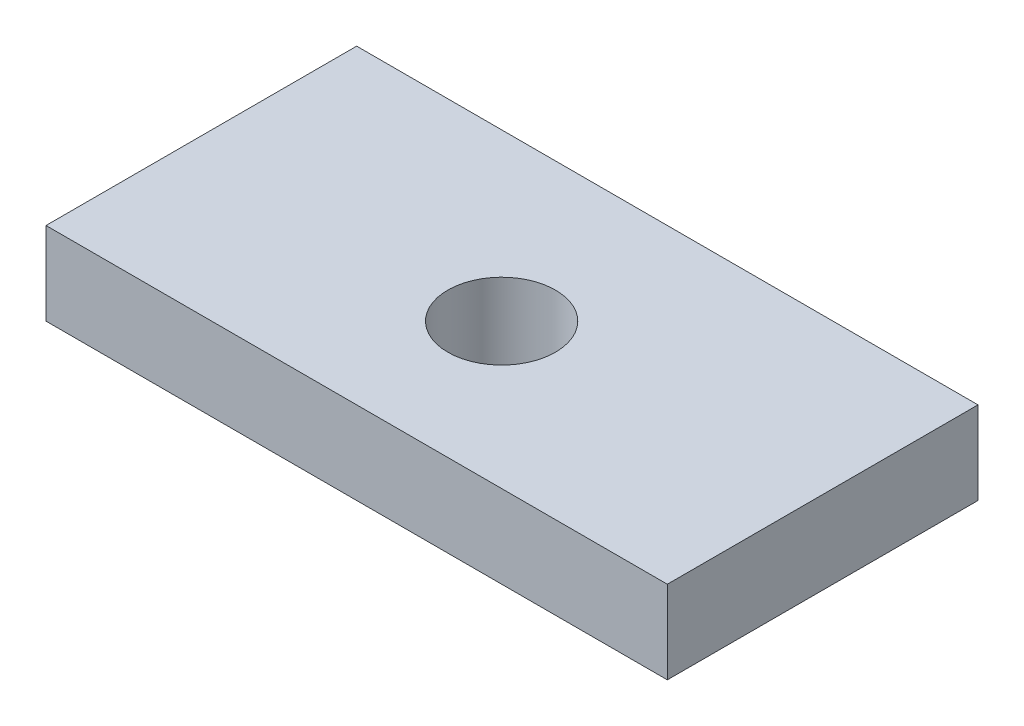
ISO-10303-21;
HEADER;
FILE_DESCRIPTION(('STEP AP214'),'2;1');
FILE_NAME('part.step','',(''),(''),'','','');
FILE_SCHEMA(('AUTOMOTIVE_DESIGN { 1 0 10303 214 1 1 1 1 }'));
ENDSEC;
DATA;
#1=APPLICATION_CONTEXT('core data for automotive mechanical design processes');
#2=APPLICATION_PROTOCOL_DEFINITION('international standard','automotive_design',2000,#1);
#3=PRODUCT_CONTEXT('',#1,'mechanical');
#4=PRODUCT('Part','Part','',(#3));
#5=PRODUCT_RELATED_PRODUCT_CATEGORY('part','',(#4));
#6=PRODUCT_DEFINITION_FORMATION('','',#4);
#7=PRODUCT_DEFINITION_CONTEXT('part definition',#1,'design');
#8=PRODUCT_DEFINITION('design','',#6,#7);
#9=PRODUCT_DEFINITION_SHAPE('','',#8);
#10=(LENGTH_UNIT() NAMED_UNIT(*) SI_UNIT(.MILLI.,.METRE.));
#11=(NAMED_UNIT(*) PLANE_ANGLE_UNIT() SI_UNIT($,.RADIAN.));
#12=(NAMED_UNIT(*) SI_UNIT($,.STERADIAN.) SOLID_ANGLE_UNIT());
#13=UNCERTAINTY_MEASURE_WITH_UNIT(LENGTH_MEASURE(1.E-05),#10,'distance_accuracy_value','');
#14=(GEOMETRIC_REPRESENTATION_CONTEXT(3) GLOBAL_UNCERTAINTY_ASSIGNED_CONTEXT((#13)) GLOBAL_UNIT_ASSIGNED_CONTEXT((#10,
#11,#12)) REPRESENTATION_CONTEXT('',''));
#15=CARTESIAN_POINT('',(0.,0.,0.));
#16=DIRECTION('',(0.,0.,1.));
#17=DIRECTION('',(1.,0.,0.));
#18=AXIS2_PLACEMENT_3D('',#15,#16,#17);
#19=CARTESIAN_POINT('',(0.,4.,0.));
#20=DIRECTION('',(0.,-1.,0.));
#21=DIRECTION('',(0.,0.,-1.));
#22=AXIS2_PLACEMENT_3D('',#19,#20,#21);
#23=PLANE('',#22);
#24=DIRECTION('',(0.,0.,1.));
#25=VECTOR('',#24,1.);
#26=CARTESIAN_POINT('',(0.,4.,0.));
#27=LINE('',#26,#25);
#28=CARTESIAN_POINT('',(0.,4.,-15.));
#29=VERTEX_POINT('',#28);
#30=CARTESIAN_POINT('',(0.,4.,0.));
#31=VERTEX_POINT('',#30);
#32=EDGE_CURVE('E93',#29,#31,#27,.T.);
#33=ORIENTED_EDGE('',*,*,#32,.T.);
#34=DIRECTION('',(1.,0.,0.));
#35=VECTOR('',#34,1.);
#36=CARTESIAN_POINT('',(0.,4.,0.));
#37=LINE('',#36,#35);
#38=CARTESIAN_POINT('',(30.,4.,0.));
#39=VERTEX_POINT('',#38);
#40=EDGE_CURVE('E88',#31,#39,#37,.T.);
#41=ORIENTED_EDGE('',*,*,#40,.T.);
#42=DIRECTION('',(0.,0.,-1.));
#43=VECTOR('',#42,1.);
#44=CARTESIAN_POINT('',(30.,4.,0.));
#45=LINE('',#44,#43);
#46=CARTESIAN_POINT('',(30.,4.,-15.));
#47=VERTEX_POINT('',#46);
#48=EDGE_CURVE('E91',#39,#47,#45,.T.);
#49=ORIENTED_EDGE('',*,*,#48,.T.);
#50=DIRECTION('',(-1.,0.,0.));
#51=VECTOR('',#50,1.);
#52=CARTESIAN_POINT('',(0.,4.,-15.));
#53=LINE('',#52,#51);
#54=EDGE_CURVE('E58',#47,#29,#53,.T.);
#55=ORIENTED_EDGE('',*,*,#54,.T.);
#56=EDGE_LOOP('',(#33,#41,#49,#55));
#57=FACE_BOUND('',#56,.T.);
#58=CARTESIAN_POINT('',(15.0000000000379,4.,-7.00000000002912));
#59=DIRECTION('',(0.,1.,0.));
#60=DIRECTION('',(0.,0.,1.));
#61=AXIS2_PLACEMENT_3D('',#58,#59,#60);
#62=CIRCLE('',#61,2.6);
#63=CARTESIAN_POINT('',(15.0000000000379,4.,-4.40000000002912));
#64=VERTEX_POINT('',#63);
#65=EDGE_CURVE('E108',#64,#64,#62,.T.);
#66=ORIENTED_EDGE('',*,*,#65,.F.);
#67=EDGE_LOOP('',(#66));
#68=FACE_BOUND('',#67,.T.);
#69=ADVANCED_FACE('F41',(#57,#68),#23,.F.);
#70=CARTESIAN_POINT('',(0.,0.,0.));
#71=DIRECTION('',(0.,-1.,0.));
#72=DIRECTION('',(0.,0.,-1.));
#73=AXIS2_PLACEMENT_3D('',#70,#71,#72);
#74=PLANE('',#73);
#75=DIRECTION('',(0.,0.,1.));
#76=VECTOR('',#75,1.);
#77=CARTESIAN_POINT('',(0.,0.,0.));
#78=LINE('',#77,#76);
#79=CARTESIAN_POINT('',(0.,0.,-15.));
#80=VERTEX_POINT('',#79);
#81=CARTESIAN_POINT('',(0.,0.,0.));
#82=VERTEX_POINT('',#81);
#83=EDGE_CURVE('E105',#80,#82,#78,.T.);
#84=ORIENTED_EDGE('',*,*,#83,.F.);
#85=DIRECTION('',(-1.,0.,0.));
#86=VECTOR('',#85,1.);
#87=CARTESIAN_POINT('',(0.,0.,-15.));
#88=LINE('',#87,#86);
#89=CARTESIAN_POINT('',(30.,0.,-15.));
#90=VERTEX_POINT('',#89);
#91=EDGE_CURVE('E81',#90,#80,#88,.T.);
#92=ORIENTED_EDGE('',*,*,#91,.F.);
#93=DIRECTION('',(0.,0.,-1.));
#94=VECTOR('',#93,1.);
#95=CARTESIAN_POINT('',(30.,0.,0.));
#96=LINE('',#95,#94);
#97=CARTESIAN_POINT('',(30.,0.,0.));
#98=VERTEX_POINT('',#97);
#99=EDGE_CURVE('E75',#98,#90,#96,.T.);
#100=ORIENTED_EDGE('',*,*,#99,.F.);
#101=DIRECTION('',(1.,0.,0.));
#102=VECTOR('',#101,1.);
#103=CARTESIAN_POINT('',(0.,0.,0.));
#104=LINE('',#103,#102);
#105=EDGE_CURVE('E97',#82,#98,#104,.T.);
#106=ORIENTED_EDGE('',*,*,#105,.F.);
#107=EDGE_LOOP('',(#84,#92,#100,#106));
#108=FACE_BOUND('',#107,.T.);
#109=CARTESIAN_POINT('',(15.0000000000379,0.,-7.00000000002912));
#110=DIRECTION('',(0.,1.,0.));
#111=DIRECTION('',(0.,0.,1.));
#112=AXIS2_PLACEMENT_3D('',#109,#110,#111);
#113=CIRCLE('',#112,2.6);
#114=CARTESIAN_POINT('',(15.0000000000379,0.,-4.40000000002912));
#115=VERTEX_POINT('',#114);
#116=EDGE_CURVE('E120',#115,#115,#113,.T.);
#117=ORIENTED_EDGE('',*,*,#116,.T.);
#118=EDGE_LOOP('',(#117));
#119=FACE_BOUND('',#118,.T.);
#120=ADVANCED_FACE('F116',(#108,#119),#74,.T.);
#121=CARTESIAN_POINT('',(0.,4.,0.));
#122=DIRECTION('',(1.,0.,0.));
#123=DIRECTION('',(0.,0.,-1.));
#124=AXIS2_PLACEMENT_3D('',#121,#122,#123);
#125=PLANE('',#124);
#126=ORIENTED_EDGE('',*,*,#83,.T.);
#127=DIRECTION('',(0.,-1.,0.));
#128=VECTOR('',#127,1.);
#129=CARTESIAN_POINT('',(0.,4.,0.));
#130=LINE('',#129,#128);
#131=EDGE_CURVE('E11',#31,#82,#130,.T.);
#132=ORIENTED_EDGE('',*,*,#131,.F.);
#133=ORIENTED_EDGE('',*,*,#32,.F.);
#134=DIRECTION('',(0.,-1.,0.));
#135=VECTOR('',#134,1.);
#136=CARTESIAN_POINT('',(0.,4.,-15.));
#137=LINE('',#136,#135);
#138=EDGE_CURVE('E101',#29,#80,#137,.T.);
#139=ORIENTED_EDGE('',*,*,#138,.T.);
#140=EDGE_LOOP('',(#126,#132,#133,#139));
#141=FACE_BOUND('',#140,.T.);
#142=ADVANCED_FACE('F43',(#141),#125,.F.);
#143=CARTESIAN_POINT('',(0.,4.,0.));
#144=DIRECTION('',(0.,0.,-1.));
#145=DIRECTION('',(-1.,0.,0.));
#146=AXIS2_PLACEMENT_3D('',#143,#144,#145);
#147=PLANE('',#146);
#148=ORIENTED_EDGE('',*,*,#105,.T.);
#149=DIRECTION('',(0.,-1.,0.));
#150=VECTOR('',#149,1.);
#151=CARTESIAN_POINT('',(30.,4.,0.));
#152=LINE('',#151,#150);
#153=EDGE_CURVE('E50',#39,#98,#152,.T.);
#154=ORIENTED_EDGE('',*,*,#153,.F.);
#155=ORIENTED_EDGE('',*,*,#40,.F.);
#156=ORIENTED_EDGE('',*,*,#131,.T.);
#157=EDGE_LOOP('',(#148,#154,#155,#156));
#158=FACE_BOUND('',#157,.T.);
#159=ADVANCED_FACE('F96',(#158),#147,.F.);
#160=CARTESIAN_POINT('',(30.,4.,0.));
#161=DIRECTION('',(-1.,0.,0.));
#162=DIRECTION('',(0.,0.,1.));
#163=AXIS2_PLACEMENT_3D('',#160,#161,#162);
#164=PLANE('',#163);
#165=ORIENTED_EDGE('',*,*,#99,.T.);
#166=DIRECTION('',(0.,-1.,0.));
#167=VECTOR('',#166,1.);
#168=CARTESIAN_POINT('',(30.,4.,-15.));
#169=LINE('',#168,#167);
#170=EDGE_CURVE('E98',#47,#90,#169,.T.);
#171=ORIENTED_EDGE('',*,*,#170,.F.);
#172=ORIENTED_EDGE('',*,*,#48,.F.);
#173=ORIENTED_EDGE('',*,*,#153,.T.);
#174=EDGE_LOOP('',(#165,#171,#172,#173));
#175=FACE_BOUND('',#174,.T.);
#176=ADVANCED_FACE('F99',(#175),#164,.F.);
#177=CARTESIAN_POINT('',(0.,4.,-15.));
#178=DIRECTION('',(0.,0.,1.));
#179=DIRECTION('',(1.,0.,0.));
#180=AXIS2_PLACEMENT_3D('',#177,#178,#179);
#181=PLANE('',#180);
#182=ORIENTED_EDGE('',*,*,#91,.T.);
#183=ORIENTED_EDGE('',*,*,#138,.F.);
#184=ORIENTED_EDGE('',*,*,#54,.F.);
#185=ORIENTED_EDGE('',*,*,#170,.T.);
#186=EDGE_LOOP('',(#182,#183,#184,#185));
#187=FACE_BOUND('',#186,.T.);
#188=ADVANCED_FACE('F113',(#187),#181,.F.);
#189=CARTESIAN_POINT('',(15.0000000000379,4.,-7.00000000002912));
#190=DIRECTION('',(0.,-1.,0.));
#191=DIRECTION('',(0.,0.,-1.));
#192=AXIS2_PLACEMENT_3D('',#189,#190,#191);
#193=CYLINDRICAL_SURFACE('',#192,2.6);
#194=ORIENTED_EDGE('',*,*,#65,.T.);
#195=EDGE_LOOP('',(#194));
#196=FACE_BOUND('',#195,.T.);
#197=ORIENTED_EDGE('',*,*,#116,.F.);
#198=EDGE_LOOP('',(#197));
#199=FACE_BOUND('',#198,.T.);
#200=ADVANCED_FACE('F126',(#196,#199),#193,.F.);
#201=CLOSED_SHELL('',(#69,#120,#142,#159,#176,#188,#200));
#202=MANIFOLD_SOLID_BREP('B2',#201);
#203=ADVANCED_BREP_SHAPE_REPRESENTATION('',(#18,#202),#14);
#204=SHAPE_DEFINITION_REPRESENTATION(#9,#203);
ENDSEC;
END-ISO-10303-21;
